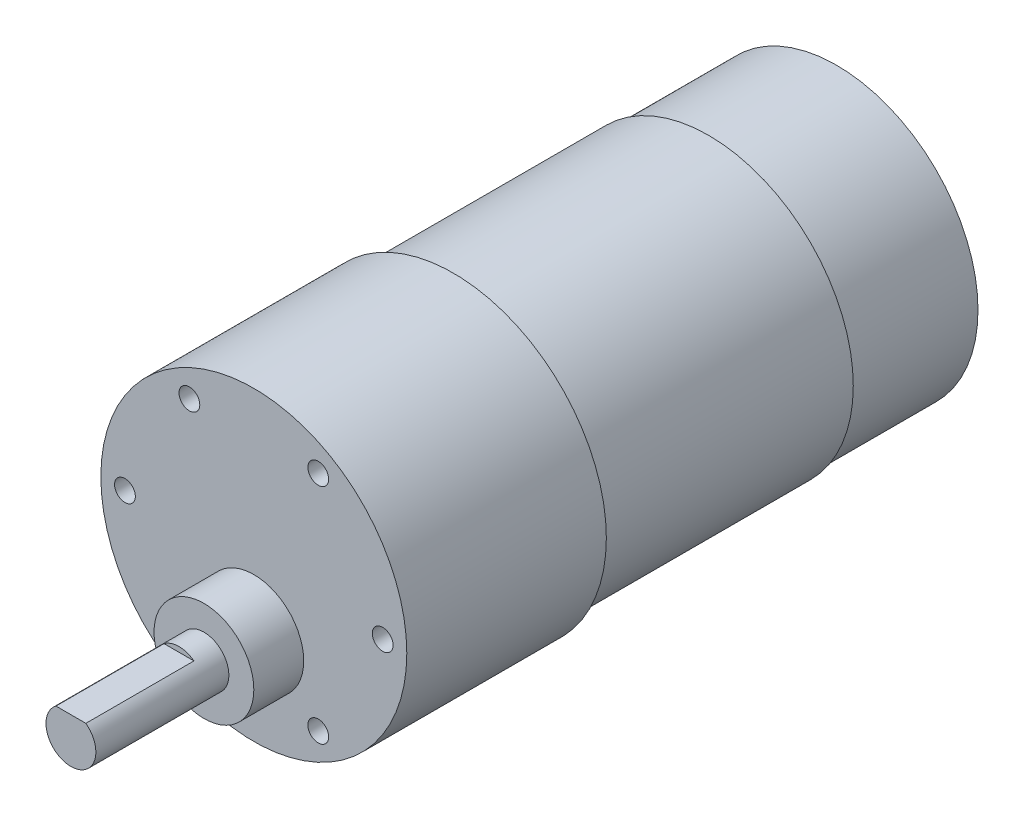
ISO-10303-21;
HEADER;
FILE_DESCRIPTION(('STEP AP214'),'2;1');
FILE_NAME('part.step','',(''),(''),'','','');
FILE_SCHEMA(('AUTOMOTIVE_DESIGN { 1 0 10303 214 1 1 1 1 }'));
ENDSEC;
DATA;
#1=APPLICATION_CONTEXT('core data for automotive mechanical design processes');
#2=APPLICATION_PROTOCOL_DEFINITION('international standard','automotive_design',2000,#1);
#3=PRODUCT_CONTEXT('',#1,'mechanical');
#4=PRODUCT('Part','Part','',(#3));
#5=PRODUCT_RELATED_PRODUCT_CATEGORY('part','',(#4));
#6=PRODUCT_DEFINITION_FORMATION('','',#4);
#7=PRODUCT_DEFINITION_CONTEXT('part definition',#1,'design');
#8=PRODUCT_DEFINITION('design','',#6,#7);
#9=PRODUCT_DEFINITION_SHAPE('','',#8);
#10=(LENGTH_UNIT() NAMED_UNIT(*) SI_UNIT(.MILLI.,.METRE.));
#11=(NAMED_UNIT(*) PLANE_ANGLE_UNIT() SI_UNIT($,.RADIAN.));
#12=(NAMED_UNIT(*) SI_UNIT($,.STERADIAN.) SOLID_ANGLE_UNIT());
#13=UNCERTAINTY_MEASURE_WITH_UNIT(LENGTH_MEASURE(1.E-05),#10,'distance_accuracy_value','');
#14=(GEOMETRIC_REPRESENTATION_CONTEXT(3) GLOBAL_UNCERTAINTY_ASSIGNED_CONTEXT((#13)) GLOBAL_UNIT_ASSIGNED_CONTEXT((#10,
#11,#12)) REPRESENTATION_CONTEXT('',''));
#15=CARTESIAN_POINT('',(0.,0.,0.));
#16=DIRECTION('',(0.,0.,1.));
#17=DIRECTION('',(1.,0.,0.));
#18=AXIS2_PLACEMENT_3D('',#15,#16,#17);
#19=CARTESIAN_POINT('',(0.,-7.,6.));
#20=DIRECTION('',(0.,0.,1.));
#21=DIRECTION('',(1.,0.,0.));
#22=AXIS2_PLACEMENT_3D('',#19,#20,#21);
#23=PLANE('',#22);
#24=CARTESIAN_POINT('',(0.,-7.,6.));
#25=DIRECTION('',(0.,0.,1.));
#26=DIRECTION('',(1.,0.,0.));
#27=AXIS2_PLACEMENT_3D('',#24,#25,#26);
#28=CIRCLE('',#27,6.);
#29=CARTESIAN_POINT('',(6.,-7.,6.));
#30=VERTEX_POINT('',#29);
#31=EDGE_CURVE('E139',#30,#30,#28,.T.);
#32=ORIENTED_EDGE('',*,*,#31,.T.);
#33=EDGE_LOOP('',(#32));
#34=FACE_BOUND('',#33,.T.);
#35=CARTESIAN_POINT('',(0.,-7.,6.));
#36=DIRECTION('',(0.,0.,1.));
#37=DIRECTION('',(1.,0.,0.));
#38=AXIS2_PLACEMENT_3D('',#35,#36,#37);
#39=CIRCLE('',#38,3.);
#40=CARTESIAN_POINT('',(3.,-7.,6.));
#41=VERTEX_POINT('',#40);
#42=EDGE_CURVE('E126',#41,#41,#39,.T.);
#43=ORIENTED_EDGE('',*,*,#42,.F.);
#44=EDGE_LOOP('',(#43));
#45=FACE_BOUND('',#44,.T.);
#46=ADVANCED_FACE('F36',(#34,#45),#23,.T.);
#47=CARTESIAN_POINT('',(0.,0.,-24.));
#48=DIRECTION('',(0.,0.,1.));
#49=DIRECTION('',(1.,0.,0.));
#50=AXIS2_PLACEMENT_3D('',#47,#48,#49);
#51=CYLINDRICAL_SURFACE('',#50,18.4);
#52=CARTESIAN_POINT('',(0.,0.,-24.));
#53=DIRECTION('',(0.,0.,1.));
#54=DIRECTION('',(1.,0.,0.));
#55=AXIS2_PLACEMENT_3D('',#52,#53,#54);
#56=CIRCLE('',#55,18.4);
#57=CARTESIAN_POINT('',(18.4,0.,-24.));
#58=VERTEX_POINT('',#57);
#59=EDGE_CURVE('E156',#58,#58,#56,.T.);
#60=ORIENTED_EDGE('',*,*,#59,.T.);
#61=EDGE_LOOP('',(#60));
#62=FACE_BOUND('',#61,.T.);
#63=CARTESIAN_POINT('',(0.,0.,0.));
#64=DIRECTION('',(0.,0.,1.));
#65=DIRECTION('',(1.,0.,0.));
#66=AXIS2_PLACEMENT_3D('',#63,#64,#65);
#67=CIRCLE('',#66,18.4);
#68=CARTESIAN_POINT('',(18.4,0.,0.));
#69=VERTEX_POINT('',#68);
#70=EDGE_CURVE('E153',#69,#69,#67,.T.);
#71=ORIENTED_EDGE('',*,*,#70,.F.);
#72=EDGE_LOOP('',(#71));
#73=FACE_BOUND('',#72,.T.);
#74=ADVANCED_FACE('F38',(#62,#73),#51,.T.);
#75=CARTESIAN_POINT('',(0.,0.,-24.));
#76=DIRECTION('',(0.,0.,1.));
#77=DIRECTION('',(1.,0.,0.));
#78=AXIS2_PLACEMENT_3D('',#75,#76,#77);
#79=PLANE('',#78);
#80=CARTESIAN_POINT('',(0.,0.,-24.));
#81=DIRECTION('',(0.,0.,-1.));
#82=DIRECTION('',(-1.,0.,0.));
#83=AXIS2_PLACEMENT_3D('',#80,#81,#82);
#84=CIRCLE('',#83,17.4);
#85=CARTESIAN_POINT('',(-17.4,0.,-24.));
#86=VERTEX_POINT('',#85);
#87=EDGE_CURVE('E150',#86,#86,#84,.T.);
#88=ORIENTED_EDGE('',*,*,#87,.F.);
#89=EDGE_LOOP('',(#88));
#90=FACE_BOUND('',#89,.T.);
#91=ORIENTED_EDGE('',*,*,#59,.F.);
#92=EDGE_LOOP('',(#91));
#93=FACE_BOUND('',#92,.T.);
#94=ADVANCED_FACE('F164',(#90,#93),#79,.F.);
#95=CARTESIAN_POINT('',(0.,0.,0.));
#96=DIRECTION('',(0.,0.,1.));
#97=DIRECTION('',(1.,0.,0.));
#98=AXIS2_PLACEMENT_3D('',#95,#96,#97);
#99=PLANE('',#98);
#100=CARTESIAN_POINT('',(7.74999999999999,13.4233937586588,0.));
#101=DIRECTION('',(0.,0.,1.));
#102=DIRECTION('',(1.,0.,0.));
#103=AXIS2_PLACEMENT_3D('',#100,#101,#102);
#104=CIRCLE('',#103,1.24999999999999);
#105=CARTESIAN_POINT('',(8.99999999999998,13.4233937586588,0.));
#106=VERTEX_POINT('',#105);
#107=EDGE_CURVE('E91',#106,#106,#104,.T.);
#108=ORIENTED_EDGE('',*,*,#107,.F.);
#109=EDGE_LOOP('',(#108));
#110=FACE_BOUND('',#109,.T.);
#111=CARTESIAN_POINT('',(-7.75,13.4233937586588,0.));
#112=DIRECTION('',(0.,0.,1.));
#113=DIRECTION('',(1.,0.,0.));
#114=AXIS2_PLACEMENT_3D('',#111,#112,#113);
#115=CIRCLE('',#114,1.24999999999999);
#116=CARTESIAN_POINT('',(-6.50000000000002,13.4233937586588,0.));
#117=VERTEX_POINT('',#116);
#118=EDGE_CURVE('E90',#117,#117,#115,.T.);
#119=ORIENTED_EDGE('',*,*,#118,.F.);
#120=EDGE_LOOP('',(#119));
#121=FACE_BOUND('',#120,.T.);
#122=CARTESIAN_POINT('',(-15.5,0.,0.));
#123=DIRECTION('',(0.,0.,1.));
#124=DIRECTION('',(1.,0.,0.));
#125=AXIS2_PLACEMENT_3D('',#122,#123,#124);
#126=CIRCLE('',#125,1.24999999999999);
#127=CARTESIAN_POINT('',(-14.25,0.,0.));
#128=VERTEX_POINT('',#127);
#129=EDGE_CURVE('E101',#128,#128,#126,.T.);
#130=ORIENTED_EDGE('',*,*,#129,.F.);
#131=EDGE_LOOP('',(#130));
#132=FACE_BOUND('',#131,.T.);
#133=CARTESIAN_POINT('',(-7.75,-13.4233937586588,0.));
#134=DIRECTION('',(0.,0.,1.));
#135=DIRECTION('',(1.,0.,0.));
#136=AXIS2_PLACEMENT_3D('',#133,#134,#135);
#137=CIRCLE('',#136,1.24999999999999);
#138=CARTESIAN_POINT('',(-6.50000000000001,-13.4233937586588,0.));
#139=VERTEX_POINT('',#138);
#140=EDGE_CURVE('E107',#139,#139,#137,.T.);
#141=ORIENTED_EDGE('',*,*,#140,.F.);
#142=EDGE_LOOP('',(#141));
#143=FACE_BOUND('',#142,.T.);
#144=CARTESIAN_POINT('',(7.75,-13.4233937586588,0.));
#145=DIRECTION('',(0.,0.,1.));
#146=DIRECTION('',(1.,0.,0.));
#147=AXIS2_PLACEMENT_3D('',#144,#145,#146);
#148=CIRCLE('',#147,1.24999999999999);
#149=CARTESIAN_POINT('',(8.99999999999999,-13.4233937586588,0.));
#150=VERTEX_POINT('',#149);
#151=EDGE_CURVE('E113',#150,#150,#148,.T.);
#152=ORIENTED_EDGE('',*,*,#151,.F.);
#153=EDGE_LOOP('',(#152));
#154=FACE_BOUND('',#153,.T.);
#155=CARTESIAN_POINT('',(15.5,0.,0.));
#156=DIRECTION('',(0.,0.,1.));
#157=DIRECTION('',(1.,0.,0.));
#158=AXIS2_PLACEMENT_3D('',#155,#156,#157);
#159=CIRCLE('',#158,1.24999999999999);
#160=CARTESIAN_POINT('',(16.75,0.,0.));
#161=VERTEX_POINT('',#160);
#162=EDGE_CURVE('E119',#161,#161,#159,.T.);
#163=ORIENTED_EDGE('',*,*,#162,.F.);
#164=EDGE_LOOP('',(#163));
#165=FACE_BOUND('',#164,.T.);
#166=CARTESIAN_POINT('',(0.,-7.,0.));
#167=DIRECTION('',(0.,0.,1.));
#168=DIRECTION('',(1.,0.,0.));
#169=AXIS2_PLACEMENT_3D('',#166,#167,#168);
#170=CIRCLE('',#169,6.);
#171=CARTESIAN_POINT('',(6.,-7.,0.));
#172=VERTEX_POINT('',#171);
#173=EDGE_CURVE('E138',#172,#172,#170,.T.);
#174=ORIENTED_EDGE('',*,*,#173,.F.);
#175=EDGE_LOOP('',(#174));
#176=FACE_BOUND('',#175,.T.);
#177=ORIENTED_EDGE('',*,*,#70,.T.);
#178=EDGE_LOOP('',(#177));
#179=FACE_BOUND('',#178,.T.);
#180=ADVANCED_FACE('F161',(#110,#121,#132,#143,#154,#165,#176,#179),#99,.T.);
#181=CARTESIAN_POINT('',(0.,0.,-54.7));
#182=DIRECTION('',(0.,0.,1.));
#183=DIRECTION('',(1.,0.,0.));
#184=AXIS2_PLACEMENT_3D('',#181,#182,#183);
#185=CYLINDRICAL_SURFACE('',#184,17.4);
#186=CARTESIAN_POINT('',(0.,0.,-54.7));
#187=DIRECTION('',(0.,0.,-1.));
#188=DIRECTION('',(-1.,0.,0.));
#189=AXIS2_PLACEMENT_3D('',#186,#187,#188);
#190=CIRCLE('',#189,17.4);
#191=CARTESIAN_POINT('',(-17.4,0.,-54.7));
#192=VERTEX_POINT('',#191);
#193=EDGE_CURVE('E147',#192,#192,#190,.T.);
#194=ORIENTED_EDGE('',*,*,#193,.F.);
#195=EDGE_LOOP('',(#194));
#196=FACE_BOUND('',#195,.T.);
#197=ORIENTED_EDGE('',*,*,#87,.T.);
#198=EDGE_LOOP('',(#197));
#199=FACE_BOUND('',#198,.T.);
#200=ADVANCED_FACE('F198',(#196,#199),#185,.T.);
#201=CARTESIAN_POINT('',(0.,0.,-54.7));
#202=DIRECTION('',(0.,0.,-1.));
#203=DIRECTION('',(-1.,0.,0.));
#204=AXIS2_PLACEMENT_3D('',#201,#202,#203);
#205=PLANE('',#204);
#206=CARTESIAN_POINT('',(0.,0.,-54.7));
#207=DIRECTION('',(0.,0.,-1.));
#208=DIRECTION('',(-1.,0.,0.));
#209=AXIS2_PLACEMENT_3D('',#206,#207,#208);
#210=CIRCLE('',#209,17.);
#211=CARTESIAN_POINT('',(17.,0.,-54.7));
#212=VERTEX_POINT('',#211);
#213=EDGE_CURVE('E44',#212,#212,#210,.T.);
#214=ORIENTED_EDGE('',*,*,#213,.F.);
#215=EDGE_LOOP('',(#214));
#216=FACE_BOUND('',#215,.T.);
#217=ORIENTED_EDGE('',*,*,#193,.T.);
#218=EDGE_LOOP('',(#217));
#219=FACE_BOUND('',#218,.T.);
#220=ADVANCED_FACE('F194',(#216,#219),#205,.T.);
#221=CARTESIAN_POINT('',(0.,0.,-70.1));
#222=DIRECTION('',(0.,0.,1.));
#223=DIRECTION('',(1.,0.,0.));
#224=AXIS2_PLACEMENT_3D('',#221,#222,#223);
#225=CYLINDRICAL_SURFACE('',#224,17.);
#226=CARTESIAN_POINT('',(0.,0.,-70.1));
#227=DIRECTION('',(0.,0.,-1.));
#228=DIRECTION('',(-1.,0.,0.));
#229=AXIS2_PLACEMENT_3D('',#226,#227,#228);
#230=CIRCLE('',#229,17.);
#231=CARTESIAN_POINT('',(17.,0.,-70.1));
#232=VERTEX_POINT('',#231);
#233=EDGE_CURVE('E142',#232,#232,#230,.T.);
#234=CARTESIAN_POINT('',(17.,0.,-70.1));
#235=CARTESIAN_POINT('',(17.,0.,-69.9395833333333));
#236=CARTESIAN_POINT('',(17.,0.,-69.7791666666667));
#237=CARTESIAN_POINT('',(17.,0.,-69.4583333333333));
#238=CARTESIAN_POINT('',(17.,0.,-69.2979166666667));
#239=CARTESIAN_POINT('',(17.,0.,-68.9770833333333));
#240=CARTESIAN_POINT('',(17.,0.,-68.8166666666666));
#241=CARTESIAN_POINT('',(17.,0.,-68.4958333333333));
#242=CARTESIAN_POINT('',(17.,0.,-68.3354166666666));
#243=CARTESIAN_POINT('',(17.,0.,-68.0145833333333));
#244=CARTESIAN_POINT('',(17.,0.,-67.8541666666666));
#245=CARTESIAN_POINT('',(17.,0.,-67.5333333333333));
#246=CARTESIAN_POINT('',(17.,0.,-67.3729166666667));
#247=CARTESIAN_POINT('',(17.,0.,-67.0520833333333));
#248=CARTESIAN_POINT('',(17.,0.,-66.8916666666667));
#249=CARTESIAN_POINT('',(17.,0.,-66.5708333333333));
#250=CARTESIAN_POINT('',(17.,0.,-66.4104166666666));
#251=CARTESIAN_POINT('',(17.,0.,-66.0895833333333));
#252=CARTESIAN_POINT('',(17.,0.,-65.9291666666666));
#253=CARTESIAN_POINT('',(17.,0.,-65.6083333333333));
#254=CARTESIAN_POINT('',(17.,0.,-65.4479166666666));
#255=CARTESIAN_POINT('',(17.,0.,-65.1270833333333));
#256=CARTESIAN_POINT('',(17.,0.,-64.9666666666667));
#257=CARTESIAN_POINT('',(17.,0.,-64.6458333333333));
#258=CARTESIAN_POINT('',(17.,0.,-64.4854166666667));
#259=CARTESIAN_POINT('',(17.,0.,-64.1645833333333));
#260=CARTESIAN_POINT('',(17.,0.,-64.0041666666666));
#261=CARTESIAN_POINT('',(17.,0.,-63.6833333333333));
#262=CARTESIAN_POINT('',(17.,0.,-63.5229166666667));
#263=CARTESIAN_POINT('',(17.,0.,-63.2020833333333));
#264=CARTESIAN_POINT('',(17.,0.,-63.0416666666667));
#265=CARTESIAN_POINT('',(17.,0.,-62.7208333333333));
#266=CARTESIAN_POINT('',(17.,0.,-62.5604166666667));
#267=CARTESIAN_POINT('',(17.,0.,-62.2395833333333));
#268=CARTESIAN_POINT('',(17.,0.,-62.0791666666667));
#269=CARTESIAN_POINT('',(17.,0.,-61.7583333333333));
#270=CARTESIAN_POINT('',(17.,0.,-61.5979166666667));
#271=CARTESIAN_POINT('',(17.,0.,-61.2770833333333));
#272=CARTESIAN_POINT('',(17.,0.,-61.1166666666667));
#273=CARTESIAN_POINT('',(17.,0.,-60.7958333333333));
#274=CARTESIAN_POINT('',(17.,0.,-60.6354166666667));
#275=CARTESIAN_POINT('',(17.,0.,-60.3145833333333));
#276=CARTESIAN_POINT('',(17.,0.,-60.1541666666667));
#277=CARTESIAN_POINT('',(17.,0.,-59.8333333333333));
#278=CARTESIAN_POINT('',(17.,0.,-59.6729166666667));
#279=CARTESIAN_POINT('',(17.,0.,-59.3520833333333));
#280=CARTESIAN_POINT('',(17.,0.,-59.1916666666667));
#281=CARTESIAN_POINT('',(17.,0.,-58.8708333333333));
#282=CARTESIAN_POINT('',(17.,0.,-58.7104166666667));
#283=CARTESIAN_POINT('',(17.,0.,-58.3895833333333));
#284=CARTESIAN_POINT('',(17.,0.,-58.2291666666667));
#285=CARTESIAN_POINT('',(17.,0.,-57.9083333333333));
#286=CARTESIAN_POINT('',(17.,0.,-57.7479166666667));
#287=CARTESIAN_POINT('',(17.,0.,-57.4270833333333));
#288=CARTESIAN_POINT('',(17.,0.,-57.2666666666667));
#289=CARTESIAN_POINT('',(17.,0.,-56.9458333333333));
#290=CARTESIAN_POINT('',(17.,0.,-56.7854166666667));
#291=CARTESIAN_POINT('',(17.,0.,-56.4645833333333));
#292=CARTESIAN_POINT('',(17.,0.,-56.3041666666667));
#293=CARTESIAN_POINT('',(17.,0.,-55.9833333333333));
#294=CARTESIAN_POINT('',(17.,0.,-55.8229166666667));
#295=CARTESIAN_POINT('',(17.,0.,-55.5020833333333));
#296=CARTESIAN_POINT('',(17.,0.,-55.3416666666667));
#297=CARTESIAN_POINT('',(17.,0.,-55.0208333333333));
#298=CARTESIAN_POINT('',(17.,0.,-54.8604166666667));
#299=CARTESIAN_POINT('',(17.,0.,-54.7));
#300=B_SPLINE_CURVE_WITH_KNOTS('',3,(#234,#235,#236,#237,#238,#239,#240,#241,#242,#243,#244,
#245,#246,#247,#248,#249,#250,#251,#252,#253,#254,#255,#256,#257,#258,#259,#260,#261,#262,#263,
#264,#265,#266,#267,#268,#269,#270,#271,#272,#273,#274,#275,#276,#277,#278,#279,#280,#281,#282,
#283,#284,#285,#286,#287,#288,#289,#290,#291,#292,#293,#294,#295,#296,#297,#298,#299),
.UNSPECIFIED.,.F.,.F.,(4,2,2,2,2,2,2,2,2,2,2,2,2,2,2,2,2,2,2,2,2,2,2,2,2,2,2,2,2,2,2,2,4),(0.,
0.481250000000003,0.962500000000005,1.44375000000001,1.92500000000001,2.40625000000001,2.8875,
3.36875,3.85000000000001,4.33125000000001,4.81250000000001,5.29375,5.775,6.25625,
6.73750000000001,7.21875000000001,7.70000000000001,8.18125,8.6625,9.14375000000001,9.625,
10.10625,10.5875,11.06875,11.55,12.03125,12.5125,12.99375,13.475,13.95625,14.4375,14.91875,
15.4),.UNSPECIFIED.);
#301=EDGE_CURVE('BSEAM190',#232,#212,#300,.T.);
#302=ORIENTED_EDGE('',*,*,#233,.F.);
#303=ORIENTED_EDGE('',*,*,#213,.T.);
#304=ORIENTED_EDGE('',*,*,#301,.T.);
#305=ORIENTED_EDGE('',*,*,#301,.F.);
#306=EDGE_LOOP('',(#302,#304,#303,#305));
#307=FACE_BOUND('',#306,.T.);
#308=ADVANCED_FACE('F190',(#307),#225,.T.);
#309=CARTESIAN_POINT('',(0.,0.,-70.1));
#310=DIRECTION('',(0.,0.,-1.));
#311=DIRECTION('',(-1.,0.,0.));
#312=AXIS2_PLACEMENT_3D('',#309,#310,#311);
#313=PLANE('',#312);
#314=ORIENTED_EDGE('',*,*,#233,.T.);
#315=EDGE_LOOP('',(#314));
#316=FACE_BOUND('',#315,.T.);
#317=ADVANCED_FACE('F186',(#316),#313,.T.);
#318=CARTESIAN_POINT('',(0.,-7.,6.));
#319=DIRECTION('',(0.,0.,-1.));
#320=DIRECTION('',(-1.,0.,0.));
#321=AXIS2_PLACEMENT_3D('',#318,#319,#320);
#322=CYLINDRICAL_SURFACE('',#321,6.);
#323=ORIENTED_EDGE('',*,*,#31,.F.);
#324=EDGE_LOOP('',(#323));
#325=FACE_BOUND('',#324,.T.);
#326=ORIENTED_EDGE('',*,*,#173,.T.);
#327=EDGE_LOOP('',(#326));
#328=FACE_BOUND('',#327,.T.);
#329=ADVANCED_FACE('F183',(#325,#328),#322,.T.);
#330=CARTESIAN_POINT('',(0.,-7.,22.));
#331=DIRECTION('',(0.,0.,-1.));
#332=DIRECTION('',(-1.,0.,0.));
#333=AXIS2_PLACEMENT_3D('',#330,#331,#332);
#334=CYLINDRICAL_SURFACE('',#333,3.);
#335=DIRECTION('',(0.,0.,-1.));
#336=VECTOR('',#335,1.);
#337=CARTESIAN_POINT('',(-1.8,-4.6,22.));
#338=LINE('',#337,#336);
#339=CARTESIAN_POINT('',(-1.8,-4.6,22.));
#340=VERTEX_POINT('',#339);
#341=CARTESIAN_POINT('',(-1.8,-4.6,9.));
#342=VERTEX_POINT('',#341);
#343=EDGE_CURVE('E130',#340,#342,#338,.T.);
#344=ORIENTED_EDGE('',*,*,#343,.T.);
#345=CARTESIAN_POINT('',(0.,-7.,9.));
#346=DIRECTION('',(0.,0.,1.));
#347=DIRECTION('',(1.,0.,0.));
#348=AXIS2_PLACEMENT_3D('',#345,#346,#347);
#349=CIRCLE('',#348,3.);
#350=CARTESIAN_POINT('',(1.8,-4.6,9.));
#351=VERTEX_POINT('',#350);
#352=EDGE_CURVE('E50',#351,#342,#349,.T.);
#353=ORIENTED_EDGE('',*,*,#352,.F.);
#354=DIRECTION('',(0.,0.,-1.));
#355=VECTOR('',#354,1.);
#356=CARTESIAN_POINT('',(1.8,-4.6,22.));
#357=LINE('',#356,#355);
#358=CARTESIAN_POINT('',(1.8,-4.6,22.));
#359=VERTEX_POINT('',#358);
#360=EDGE_CURVE('E135',#359,#351,#357,.T.);
#361=ORIENTED_EDGE('',*,*,#360,.F.);
#362=CARTESIAN_POINT('',(0.,-7.,22.));
#363=DIRECTION('',(0.,0.,1.));
#364=DIRECTION('',(1.,0.,0.));
#365=AXIS2_PLACEMENT_3D('',#362,#363,#364);
#366=CIRCLE('',#365,3.);
#367=EDGE_CURVE('E127',#340,#359,#366,.T.);
#368=ORIENTED_EDGE('',*,*,#367,.F.);
#369=EDGE_LOOP('',(#344,#353,#361,#368));
#370=FACE_BOUND('',#369,.T.);
#371=ORIENTED_EDGE('',*,*,#42,.T.);
#372=EDGE_LOOP('',(#371));
#373=FACE_BOUND('',#372,.T.);
#374=ADVANCED_FACE('F181',(#370,#373),#334,.T.);
#375=CARTESIAN_POINT('',(-1.8,-4.6,22.));
#376=DIRECTION('',(0.,-1.,0.));
#377=DIRECTION('',(1.,0.,0.));
#378=AXIS2_PLACEMENT_3D('',#375,#376,#377);
#379=PLANE('',#378);
#380=ORIENTED_EDGE('',*,*,#360,.T.);
#381=DIRECTION('',(-1.,0.,0.));
#382=VECTOR('',#381,1.);
#383=CARTESIAN_POINT('',(-1.8,-4.6,9.));
#384=LINE('',#383,#382);
#385=EDGE_CURVE('E11',#351,#342,#384,.T.);
#386=ORIENTED_EDGE('',*,*,#385,.T.);
#387=ORIENTED_EDGE('',*,*,#343,.F.);
#388=DIRECTION('',(-1.,0.,0.));
#389=VECTOR('',#388,1.);
#390=CARTESIAN_POINT('',(-1.8,-4.6,22.));
#391=LINE('',#390,#389);
#392=EDGE_CURVE('E56',#359,#340,#391,.T.);
#393=ORIENTED_EDGE('',*,*,#392,.F.);
#394=EDGE_LOOP('',(#380,#386,#387,#393));
#395=FACE_BOUND('',#394,.T.);
#396=ADVANCED_FACE('F244',(#395),#379,.F.);
#397=CARTESIAN_POINT('',(0.,-7.,22.));
#398=DIRECTION('',(0.,0.,1.));
#399=DIRECTION('',(1.,0.,0.));
#400=AXIS2_PLACEMENT_3D('',#397,#398,#399);
#401=PLANE('',#400);
#402=ORIENTED_EDGE('',*,*,#367,.T.);
#403=ORIENTED_EDGE('',*,*,#392,.T.);
#404=EDGE_LOOP('',(#402,#403));
#405=FACE_BOUND('',#404,.T.);
#406=ADVANCED_FACE('F242',(#405),#401,.T.);
#407=CARTESIAN_POINT('',(0.,-7.,9.));
#408=DIRECTION('',(0.,0.,1.));
#409=DIRECTION('',(1.,0.,0.));
#410=AXIS2_PLACEMENT_3D('',#407,#408,#409);
#411=PLANE('',#410);
#412=ORIENTED_EDGE('',*,*,#385,.F.);
#413=ORIENTED_EDGE('',*,*,#352,.T.);
#414=EDGE_LOOP('',(#412,#413));
#415=FACE_BOUND('',#414,.T.);
#416=ADVANCED_FACE('F234',(#415),#411,.T.);
#417=CARTESIAN_POINT('',(15.5,0.,-7.99999999999999));
#418=DIRECTION('',(0.,0.,1.));
#419=DIRECTION('',(1.,0.,0.));
#420=AXIS2_PLACEMENT_3D('',#417,#418,#419);
#421=CONICAL_SURFACE('',#420,1.24999999999999,1.02974425867664);
#422=CARTESIAN_POINT('',(15.5,0.,-8.75107577378445));
#423=VERTEX_POINT('',#422);
#424=VERTEX_LOOP('',#423);
#425=FACE_BOUND('',#424,.T.);
#426=CARTESIAN_POINT('',(15.5,0.,-7.99999999999999));
#427=DIRECTION('',(0.,0.,1.));
#428=DIRECTION('',(1.,0.,0.));
#429=AXIS2_PLACEMENT_3D('',#426,#427,#428);
#430=CIRCLE('',#429,1.24999999999999);
#431=CARTESIAN_POINT('',(16.75,0.,-7.99999999999999));
#432=VERTEX_POINT('',#431);
#433=EDGE_CURVE('E122',#432,#432,#430,.T.);
#434=ORIENTED_EDGE('',*,*,#433,.T.);
#435=EDGE_LOOP('',(#434));
#436=FACE_BOUND('',#435,.T.);
#437=ADVANCED_FACE('F224',(#425,#436),#421,.F.);
#438=CARTESIAN_POINT('',(15.5,0.,0.));
#439=DIRECTION('',(0.,0.,1.));
#440=DIRECTION('',(1.,0.,0.));
#441=AXIS2_PLACEMENT_3D('',#438,#439,#440);
#442=CYLINDRICAL_SURFACE('',#441,1.24999999999999);
#443=ORIENTED_EDGE('',*,*,#433,.F.);
#444=EDGE_LOOP('',(#443));
#445=FACE_BOUND('',#444,.T.);
#446=ORIENTED_EDGE('',*,*,#162,.T.);
#447=EDGE_LOOP('',(#446));
#448=FACE_BOUND('',#447,.T.);
#449=ADVANCED_FACE('F221',(#445,#448),#442,.F.);
#450=CARTESIAN_POINT('',(7.75,-13.4233937586588,-7.99999999999999));
#451=DIRECTION('',(0.,0.,1.));
#452=DIRECTION('',(1.,0.,0.));
#453=AXIS2_PLACEMENT_3D('',#450,#451,#452);
#454=CONICAL_SURFACE('',#453,1.24999999999999,1.02974425867664);
#455=CARTESIAN_POINT('',(7.75,-13.4233937586588,-8.75107577378445));
#456=VERTEX_POINT('',#455);
#457=VERTEX_LOOP('',#456);
#458=FACE_BOUND('',#457,.T.);
#459=CARTESIAN_POINT('',(7.75,-13.4233937586588,-7.99999999999999));
#460=DIRECTION('',(0.,0.,1.));
#461=DIRECTION('',(1.,0.,0.));
#462=AXIS2_PLACEMENT_3D('',#459,#460,#461);
#463=CIRCLE('',#462,1.24999999999999);
#464=CARTESIAN_POINT('',(8.99999999999999,-13.4233937586588,-7.99999999999999));
#465=VERTEX_POINT('',#464);
#466=EDGE_CURVE('E116',#465,#465,#463,.T.);
#467=ORIENTED_EDGE('',*,*,#466,.T.);
#468=EDGE_LOOP('',(#467));
#469=FACE_BOUND('',#468,.T.);
#470=ADVANCED_FACE('F223',(#458,#469),#454,.F.);
#471=CARTESIAN_POINT('',(7.75,-13.4233937586588,0.));
#472=DIRECTION('',(0.,0.,1.));
#473=DIRECTION('',(1.,0.,0.));
#474=AXIS2_PLACEMENT_3D('',#471,#472,#473);
#475=CYLINDRICAL_SURFACE('',#474,1.24999999999999);
#476=ORIENTED_EDGE('',*,*,#466,.F.);
#477=EDGE_LOOP('',(#476));
#478=FACE_BOUND('',#477,.T.);
#479=ORIENTED_EDGE('',*,*,#151,.T.);
#480=EDGE_LOOP('',(#479));
#481=FACE_BOUND('',#480,.T.);
#482=ADVANCED_FACE('F231',(#478,#481),#475,.F.);
#483=CARTESIAN_POINT('',(-7.75,-13.4233937586588,-7.99999999999999));
#484=DIRECTION('',(0.,0.,1.));
#485=DIRECTION('',(1.,0.,0.));
#486=AXIS2_PLACEMENT_3D('',#483,#484,#485);
#487=CONICAL_SURFACE('',#486,1.24999999999999,1.02974425867664);
#488=CARTESIAN_POINT('',(-7.75,-13.4233937586588,-8.75107577378445));
#489=VERTEX_POINT('',#488);
#490=VERTEX_LOOP('',#489);
#491=FACE_BOUND('',#490,.T.);
#492=CARTESIAN_POINT('',(-7.75,-13.4233937586588,-7.99999999999999));
#493=DIRECTION('',(0.,0.,1.));
#494=DIRECTION('',(1.,0.,0.));
#495=AXIS2_PLACEMENT_3D('',#492,#493,#494);
#496=CIRCLE('',#495,1.24999999999999);
#497=CARTESIAN_POINT('',(-6.50000000000001,-13.4233937586588,-7.99999999999999));
#498=VERTEX_POINT('',#497);
#499=EDGE_CURVE('E110',#498,#498,#496,.T.);
#500=ORIENTED_EDGE('',*,*,#499,.T.);
#501=EDGE_LOOP('',(#500));
#502=FACE_BOUND('',#501,.T.);
#503=ADVANCED_FACE('F324',(#491,#502),#487,.F.);
#504=CARTESIAN_POINT('',(-7.75,-13.4233937586588,0.));
#505=DIRECTION('',(0.,0.,1.));
#506=DIRECTION('',(1.,0.,0.));
#507=AXIS2_PLACEMENT_3D('',#504,#505,#506);
#508=CYLINDRICAL_SURFACE('',#507,1.24999999999999);
#509=ORIENTED_EDGE('',*,*,#499,.F.);
#510=EDGE_LOOP('',(#509));
#511=FACE_BOUND('',#510,.T.);
#512=ORIENTED_EDGE('',*,*,#140,.T.);
#513=EDGE_LOOP('',(#512));
#514=FACE_BOUND('',#513,.T.);
#515=ADVANCED_FACE('F335',(#511,#514),#508,.F.);
#516=CARTESIAN_POINT('',(-15.5,0.,-7.99999999999999));
#517=DIRECTION('',(0.,0.,1.));
#518=DIRECTION('',(1.,0.,0.));
#519=AXIS2_PLACEMENT_3D('',#516,#517,#518);
#520=CONICAL_SURFACE('',#519,1.24999999999999,1.02974425867664);
#521=CARTESIAN_POINT('',(-15.5,0.,-8.75107577378445));
#522=VERTEX_POINT('',#521);
#523=VERTEX_LOOP('',#522);
#524=FACE_BOUND('',#523,.T.);
#525=CARTESIAN_POINT('',(-15.5,0.,-7.99999999999999));
#526=DIRECTION('',(0.,0.,1.));
#527=DIRECTION('',(1.,0.,0.));
#528=AXIS2_PLACEMENT_3D('',#525,#526,#527);
#529=CIRCLE('',#528,1.24999999999999);
#530=CARTESIAN_POINT('',(-14.25,0.,-7.99999999999999));
#531=VERTEX_POINT('',#530);
#532=EDGE_CURVE('E104',#531,#531,#529,.T.);
#533=ORIENTED_EDGE('',*,*,#532,.T.);
#534=EDGE_LOOP('',(#533));
#535=FACE_BOUND('',#534,.T.);
#536=ADVANCED_FACE('F345',(#524,#535),#520,.F.);
#537=CARTESIAN_POINT('',(-15.5,0.,0.));
#538=DIRECTION('',(0.,0.,1.));
#539=DIRECTION('',(1.,0.,0.));
#540=AXIS2_PLACEMENT_3D('',#537,#538,#539);
#541=CYLINDRICAL_SURFACE('',#540,1.24999999999999);
#542=ORIENTED_EDGE('',*,*,#532,.F.);
#543=EDGE_LOOP('',(#542));
#544=FACE_BOUND('',#543,.T.);
#545=ORIENTED_EDGE('',*,*,#129,.T.);
#546=EDGE_LOOP('',(#545));
#547=FACE_BOUND('',#546,.T.);
#548=ADVANCED_FACE('F357',(#544,#547),#541,.F.);
#549=CARTESIAN_POINT('',(-7.75,13.4233937586588,-7.99999999999999));
#550=DIRECTION('',(0.,0.,1.));
#551=DIRECTION('',(1.,0.,0.));
#552=AXIS2_PLACEMENT_3D('',#549,#550,#551);
#553=CONICAL_SURFACE('',#552,1.24999999999999,1.02974425867664);
#554=CARTESIAN_POINT('',(-7.75000000000001,13.4233937586588,-8.75107577378445));
#555=VERTEX_POINT('',#554);
#556=VERTEX_LOOP('',#555);
#557=FACE_BOUND('',#556,.T.);
#558=CARTESIAN_POINT('',(-7.75,13.4233937586588,-7.99999999999999));
#559=DIRECTION('',(0.,0.,1.));
#560=DIRECTION('',(1.,0.,0.));
#561=AXIS2_PLACEMENT_3D('',#558,#559,#560);
#562=CIRCLE('',#561,1.24999999999999);
#563=CARTESIAN_POINT('',(-6.50000000000002,13.4233937586588,-7.99999999999999));
#564=VERTEX_POINT('',#563);
#565=EDGE_CURVE('E94',#564,#564,#562,.T.);
#566=ORIENTED_EDGE('',*,*,#565,.T.);
#567=EDGE_LOOP('',(#566));
#568=FACE_BOUND('',#567,.T.);
#569=ADVANCED_FACE('F367',(#557,#568),#553,.F.);
#570=CARTESIAN_POINT('',(-7.75,13.4233937586588,0.));
#571=DIRECTION('',(0.,0.,1.));
#572=DIRECTION('',(1.,0.,0.));
#573=AXIS2_PLACEMENT_3D('',#570,#571,#572);
#574=CYLINDRICAL_SURFACE('',#573,1.24999999999999);
#575=ORIENTED_EDGE('',*,*,#565,.F.);
#576=EDGE_LOOP('',(#575));
#577=FACE_BOUND('',#576,.T.);
#578=ORIENTED_EDGE('',*,*,#118,.T.);
#579=EDGE_LOOP('',(#578));
#580=FACE_BOUND('',#579,.T.);
#581=ADVANCED_FACE('F84',(#577,#580),#574,.F.);
#582=CARTESIAN_POINT('',(7.74999999999999,13.4233937586588,-7.99999999999999));
#583=DIRECTION('',(0.,0.,1.));
#584=DIRECTION('',(1.,0.,0.));
#585=AXIS2_PLACEMENT_3D('',#582,#583,#584);
#586=CONICAL_SURFACE('',#585,1.24999999999999,1.02974425867664);
#587=CARTESIAN_POINT('',(7.74999999999999,13.4233937586588,-8.75107577378445));
#588=VERTEX_POINT('',#587);
#589=VERTEX_LOOP('',#588);
#590=FACE_BOUND('',#589,.T.);
#591=CARTESIAN_POINT('',(7.74999999999999,13.4233937586588,-7.99999999999999));
#592=DIRECTION('',(0.,0.,1.));
#593=DIRECTION('',(1.,0.,0.));
#594=AXIS2_PLACEMENT_3D('',#591,#592,#593);
#595=CIRCLE('',#594,1.24999999999999);
#596=CARTESIAN_POINT('',(8.99999999999998,13.4233937586588,-7.99999999999999));
#597=VERTEX_POINT('',#596);
#598=EDGE_CURVE('E88',#597,#597,#595,.T.);
#599=ORIENTED_EDGE('',*,*,#598,.T.);
#600=EDGE_LOOP('',(#599));
#601=FACE_BOUND('',#600,.T.);
#602=ADVANCED_FACE('F80',(#590,#601),#586,.F.);
#603=CARTESIAN_POINT('',(7.74999999999999,13.4233937586588,0.));
#604=DIRECTION('',(0.,0.,1.));
#605=DIRECTION('',(1.,0.,0.));
#606=AXIS2_PLACEMENT_3D('',#603,#604,#605);
#607=CYLINDRICAL_SURFACE('',#606,1.24999999999999);
#608=ORIENTED_EDGE('',*,*,#598,.F.);
#609=EDGE_LOOP('',(#608));
#610=FACE_BOUND('',#609,.T.);
#611=ORIENTED_EDGE('',*,*,#107,.T.);
#612=EDGE_LOOP('',(#611));
#613=FACE_BOUND('',#612,.T.);
#614=ADVANCED_FACE('F83',(#610,#613),#607,.F.);
#615=CLOSED_SHELL('',(#46,#74,#94,#180,#200,#220,#308,#317,#329,#374,#396,#406,#416,#437,#449,
#470,#482,#503,#515,#536,#548,#569,#581,#602,#614));
#616=MANIFOLD_SOLID_BREP('B2',#615);
#617=ADVANCED_BREP_SHAPE_REPRESENTATION('',(#18,#616),#14);
#618=SHAPE_DEFINITION_REPRESENTATION(#9,#617);
ENDSEC;
END-ISO-10303-21;
